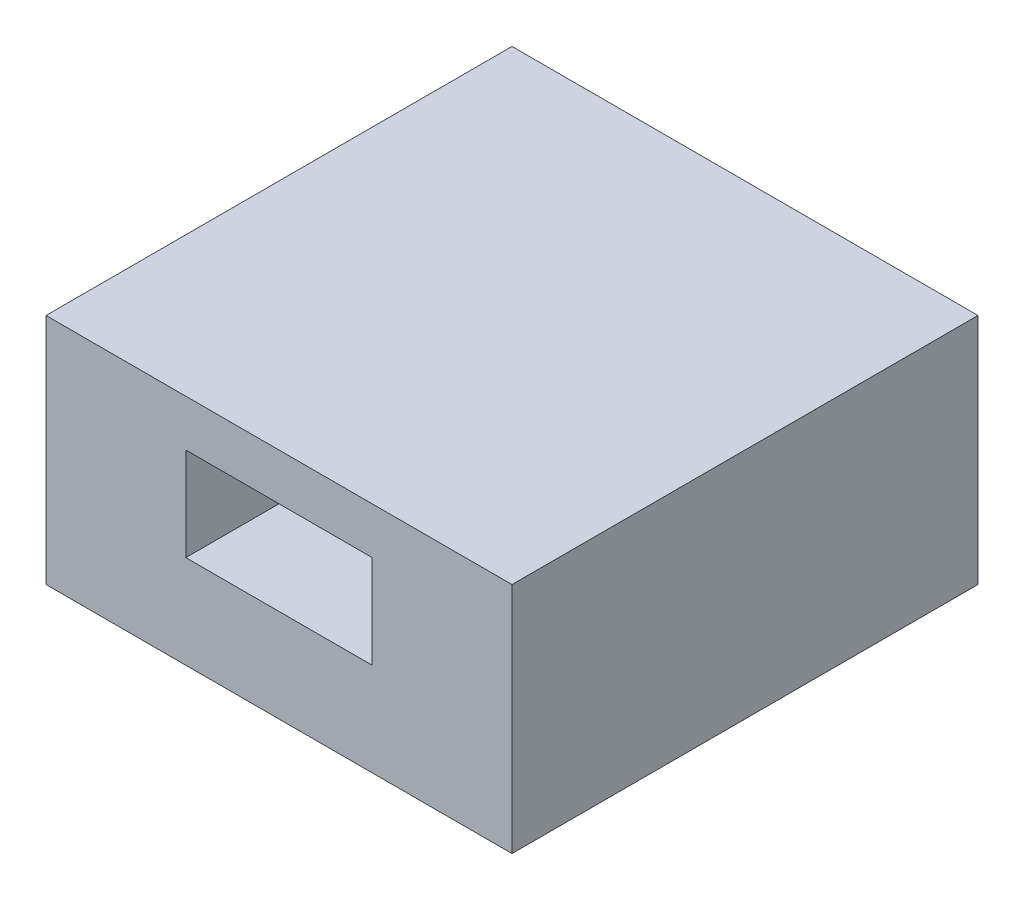
ISO-10303-21;
HEADER;
FILE_DESCRIPTION(('STEP AP214'),'2;1');
FILE_NAME('part.step','',(''),(''),'','','');
FILE_SCHEMA(('AUTOMOTIVE_DESIGN { 1 0 10303 214 1 1 1 1 }'));
ENDSEC;
DATA;
#1=APPLICATION_CONTEXT('core data for automotive mechanical design processes');
#2=APPLICATION_PROTOCOL_DEFINITION('international standard','automotive_design',2000,#1);
#3=PRODUCT_CONTEXT('',#1,'mechanical');
#4=PRODUCT('Part','Part','',(#3));
#5=PRODUCT_RELATED_PRODUCT_CATEGORY('part','',(#4));
#6=PRODUCT_DEFINITION_FORMATION('','',#4);
#7=PRODUCT_DEFINITION_CONTEXT('part definition',#1,'design');
#8=PRODUCT_DEFINITION('design','',#6,#7);
#9=PRODUCT_DEFINITION_SHAPE('','',#8);
#10=(LENGTH_UNIT() NAMED_UNIT(*) SI_UNIT(.MILLI.,.METRE.));
#11=(NAMED_UNIT(*) PLANE_ANGLE_UNIT() SI_UNIT($,.RADIAN.));
#12=(NAMED_UNIT(*) SI_UNIT($,.STERADIAN.) SOLID_ANGLE_UNIT());
#13=UNCERTAINTY_MEASURE_WITH_UNIT(LENGTH_MEASURE(1.E-05),#10,'distance_accuracy_value','');
#14=(GEOMETRIC_REPRESENTATION_CONTEXT(3) GLOBAL_UNCERTAINTY_ASSIGNED_CONTEXT((#13)) GLOBAL_UNIT_ASSIGNED_CONTEXT((#10,
#11,#12)) REPRESENTATION_CONTEXT('',''));
#15=CARTESIAN_POINT('',(0.,0.,0.));
#16=DIRECTION('',(0.,0.,1.));
#17=DIRECTION('',(1.,0.,0.));
#18=AXIS2_PLACEMENT_3D('',#15,#16,#17);
#19=CARTESIAN_POINT('',(0.,0.,8.));
#20=DIRECTION('',(0.,1.,0.));
#21=DIRECTION('',(0.,0.,1.));
#22=AXIS2_PLACEMENT_3D('',#19,#20,#21);
#23=CYLINDRICAL_SURFACE('',#22,3.);
#24=CARTESIAN_POINT('',(0.,0.,8.));
#25=DIRECTION('',(0.,1.,0.));
#26=DIRECTION('',(0.,0.,1.));
#27=AXIS2_PLACEMENT_3D('',#24,#25,#26);
#28=CIRCLE('',#27,3.);
#29=CARTESIAN_POINT('',(0.,0.,11.));
#30=VERTEX_POINT('',#29);
#31=EDGE_CURVE('E194',#30,#30,#28,.T.);
#32=ORIENTED_EDGE('',*,*,#31,.F.);
#33=EDGE_LOOP('',(#32));
#34=FACE_BOUND('',#33,.T.);
#35=CARTESIAN_POINT('',(0.,5.,8.));
#36=DIRECTION('',(0.,1.,0.));
#37=DIRECTION('',(0.,0.,1.));
#38=AXIS2_PLACEMENT_3D('',#35,#36,#37);
#39=CIRCLE('',#38,3.);
#40=CARTESIAN_POINT('',(0.,5.,11.));
#41=VERTEX_POINT('',#40);
#42=EDGE_CURVE('E41',#41,#41,#39,.F.);
#43=ORIENTED_EDGE('',*,*,#42,.F.);
#44=EDGE_LOOP('',(#43));
#45=FACE_BOUND('',#44,.T.);
#46=ADVANCED_FACE('F37',(#34,#45),#23,.F.);
#47=CARTESIAN_POINT('',(-25.,25.,0.));
#48=DIRECTION('',(1.,0.,0.));
#49=DIRECTION('',(0.,0.,-1.));
#50=AXIS2_PLACEMENT_3D('',#47,#48,#49);
#51=PLANE('',#50);
#52=DIRECTION('',(0.,0.,1.));
#53=VECTOR('',#52,1.);
#54=CARTESIAN_POINT('',(-25.,0.,0.));
#55=LINE('',#54,#53);
#56=CARTESIAN_POINT('',(-25.,0.,0.));
#57=VERTEX_POINT('',#56);
#58=CARTESIAN_POINT('',(-25.,0.,50.));
#59=VERTEX_POINT('',#58);
#60=EDGE_CURVE('E222',#57,#59,#55,.T.);
#61=ORIENTED_EDGE('',*,*,#60,.T.);
#62=DIRECTION('',(0.,-1.,0.));
#63=VECTOR('',#62,1.);
#64=CARTESIAN_POINT('',(-25.,25.,50.));
#65=LINE('',#64,#63);
#66=CARTESIAN_POINT('',(-25.,25.,50.));
#67=VERTEX_POINT('',#66);
#68=EDGE_CURVE('E11',#67,#59,#65,.T.);
#69=ORIENTED_EDGE('',*,*,#68,.F.);
#70=DIRECTION('',(0.,0.,1.));
#71=VECTOR('',#70,1.);
#72=CARTESIAN_POINT('',(-25.,25.,0.));
#73=LINE('',#72,#71);
#74=CARTESIAN_POINT('',(-25.,25.,0.));
#75=VERTEX_POINT('',#74);
#76=EDGE_CURVE('E228',#75,#67,#73,.T.);
#77=ORIENTED_EDGE('',*,*,#76,.F.);
#78=DIRECTION('',(0.,-1.,0.));
#79=VECTOR('',#78,1.);
#80=CARTESIAN_POINT('',(-25.,25.,0.));
#81=LINE('',#80,#79);
#82=EDGE_CURVE('E238',#75,#57,#81,.T.);
#83=ORIENTED_EDGE('',*,*,#82,.T.);
#84=EDGE_LOOP('',(#61,#69,#77,#83));
#85=FACE_BOUND('',#84,.T.);
#86=ADVANCED_FACE('F39',(#85),#51,.F.);
#87=CARTESIAN_POINT('',(-25.,25.,50.));
#88=DIRECTION('',(0.,0.,-1.));
#89=DIRECTION('',(-1.,0.,0.));
#90=AXIS2_PLACEMENT_3D('',#87,#88,#89);
#91=PLANE('',#90);
#92=DIRECTION('',(1.,0.,0.));
#93=VECTOR('',#92,1.);
#94=CARTESIAN_POINT('',(-10.,10.,50.));
#95=LINE('',#94,#93);
#96=CARTESIAN_POINT('',(-10.,10.,50.));
#97=VERTEX_POINT('',#96);
#98=CARTESIAN_POINT('',(10.,10.,50.));
#99=VERTEX_POINT('',#98);
#100=EDGE_CURVE('E212',#97,#99,#95,.T.);
#101=ORIENTED_EDGE('',*,*,#100,.F.);
#102=DIRECTION('',(0.,-1.,0.));
#103=VECTOR('',#102,1.);
#104=CARTESIAN_POINT('',(-10.,20.,50.));
#105=LINE('',#104,#103);
#106=CARTESIAN_POINT('',(-10.,20.,50.));
#107=VERTEX_POINT('',#106);
#108=EDGE_CURVE('E61',#107,#97,#105,.T.);
#109=ORIENTED_EDGE('',*,*,#108,.F.);
#110=DIRECTION('',(-1.,0.,0.));
#111=VECTOR('',#110,1.);
#112=CARTESIAN_POINT('',(10.,20.,50.));
#113=LINE('',#112,#111);
#114=CARTESIAN_POINT('',(10.,20.,50.));
#115=VERTEX_POINT('',#114);
#116=EDGE_CURVE('E201',#115,#107,#113,.T.);
#117=ORIENTED_EDGE('',*,*,#116,.F.);
#118=DIRECTION('',(0.,1.,0.));
#119=VECTOR('',#118,1.);
#120=CARTESIAN_POINT('',(10.,20.,50.));
#121=LINE('',#120,#119);
#122=EDGE_CURVE('E215',#99,#115,#121,.T.);
#123=ORIENTED_EDGE('',*,*,#122,.F.);
#124=EDGE_LOOP('',(#101,#109,#117,#123));
#125=FACE_BOUND('',#124,.T.);
#126=DIRECTION('',(1.,0.,0.));
#127=VECTOR('',#126,1.);
#128=CARTESIAN_POINT('',(-25.,0.,50.));
#129=LINE('',#128,#127);
#130=CARTESIAN_POINT('',(25.,0.,50.));
#131=VERTEX_POINT('',#130);
#132=EDGE_CURVE('E241',#59,#131,#129,.T.);
#133=ORIENTED_EDGE('',*,*,#132,.T.);
#134=DIRECTION('',(0.,-1.,0.));
#135=VECTOR('',#134,1.);
#136=CARTESIAN_POINT('',(25.,25.,50.));
#137=LINE('',#136,#135);
#138=CARTESIAN_POINT('',(25.,25.,50.));
#139=VERTEX_POINT('',#138);
#140=EDGE_CURVE('E46',#139,#131,#137,.T.);
#141=ORIENTED_EDGE('',*,*,#140,.F.);
#142=DIRECTION('',(1.,0.,0.));
#143=VECTOR('',#142,1.);
#144=CARTESIAN_POINT('',(-25.,25.,50.));
#145=LINE('',#144,#143);
#146=EDGE_CURVE('E231',#67,#139,#145,.T.);
#147=ORIENTED_EDGE('',*,*,#146,.F.);
#148=ORIENTED_EDGE('',*,*,#68,.T.);
#149=EDGE_LOOP('',(#133,#141,#147,#148));
#150=FACE_BOUND('',#149,.T.);
#151=ADVANCED_FACE('F272',(#125,#150),#91,.F.);
#152=CARTESIAN_POINT('',(25.,25.,0.));
#153=DIRECTION('',(-1.,0.,0.));
#154=DIRECTION('',(0.,0.,1.));
#155=AXIS2_PLACEMENT_3D('',#152,#153,#154);
#156=PLANE('',#155);
#157=DIRECTION('',(0.,0.,-1.));
#158=VECTOR('',#157,1.);
#159=CARTESIAN_POINT('',(25.,0.,0.));
#160=LINE('',#159,#158);
#161=CARTESIAN_POINT('',(25.,0.,0.));
#162=VERTEX_POINT('',#161);
#163=EDGE_CURVE('E243',#131,#162,#160,.T.);
#164=ORIENTED_EDGE('',*,*,#163,.T.);
#165=DIRECTION('',(0.,-1.,0.));
#166=VECTOR('',#165,1.);
#167=CARTESIAN_POINT('',(25.,25.,0.));
#168=LINE('',#167,#166);
#169=CARTESIAN_POINT('',(25.,25.,0.));
#170=VERTEX_POINT('',#169);
#171=EDGE_CURVE('E248',#170,#162,#168,.T.);
#172=ORIENTED_EDGE('',*,*,#171,.F.);
#173=DIRECTION('',(0.,0.,-1.));
#174=VECTOR('',#173,1.);
#175=CARTESIAN_POINT('',(25.,25.,0.));
#176=LINE('',#175,#174);
#177=EDGE_CURVE('E234',#139,#170,#176,.T.);
#178=ORIENTED_EDGE('',*,*,#177,.F.);
#179=ORIENTED_EDGE('',*,*,#140,.T.);
#180=EDGE_LOOP('',(#164,#172,#178,#179));
#181=FACE_BOUND('',#180,.T.);
#182=ADVANCED_FACE('F256',(#181),#156,.F.);
#183=CARTESIAN_POINT('',(25.,25.,0.));
#184=DIRECTION('',(0.,0.,1.));
#185=DIRECTION('',(1.,0.,0.));
#186=AXIS2_PLACEMENT_3D('',#183,#184,#185);
#187=PLANE('',#186);
#188=DIRECTION('',(-1.,0.,0.));
#189=VECTOR('',#188,1.);
#190=CARTESIAN_POINT('',(10.,20.,0.));
#191=LINE('',#190,#189);
#192=CARTESIAN_POINT('',(10.,20.,0.));
#193=VERTEX_POINT('',#192);
#194=CARTESIAN_POINT('',(-10.,20.,0.));
#195=VERTEX_POINT('',#194);
#196=EDGE_CURVE('E207',#193,#195,#191,.T.);
#197=ORIENTED_EDGE('',*,*,#196,.T.);
#198=DIRECTION('',(0.,-1.,0.));
#199=VECTOR('',#198,1.);
#200=CARTESIAN_POINT('',(-10.,20.,0.));
#201=LINE('',#200,#199);
#202=CARTESIAN_POINT('',(-10.,10.,0.));
#203=VERTEX_POINT('',#202);
#204=EDGE_CURVE('E197',#195,#203,#201,.T.);
#205=ORIENTED_EDGE('',*,*,#204,.T.);
#206=DIRECTION('',(1.,0.,0.));
#207=VECTOR('',#206,1.);
#208=CARTESIAN_POINT('',(-10.,10.,0.));
#209=LINE('',#208,#207);
#210=CARTESIAN_POINT('',(10.,10.,0.));
#211=VERTEX_POINT('',#210);
#212=EDGE_CURVE('E200',#203,#211,#209,.T.);
#213=ORIENTED_EDGE('',*,*,#212,.T.);
#214=DIRECTION('',(0.,1.,0.));
#215=VECTOR('',#214,1.);
#216=CARTESIAN_POINT('',(10.,20.,0.));
#217=LINE('',#216,#215);
#218=EDGE_CURVE('E204',#211,#193,#217,.T.);
#219=ORIENTED_EDGE('',*,*,#218,.T.);
#220=EDGE_LOOP('',(#197,#205,#213,#219));
#221=FACE_BOUND('',#220,.T.);
#222=DIRECTION('',(-1.,0.,0.));
#223=VECTOR('',#222,1.);
#224=CARTESIAN_POINT('',(25.,0.,0.));
#225=LINE('',#224,#223);
#226=EDGE_CURVE('E232',#162,#57,#225,.T.);
#227=ORIENTED_EDGE('',*,*,#226,.T.);
#228=ORIENTED_EDGE('',*,*,#82,.F.);
#229=DIRECTION('',(-1.,0.,0.));
#230=VECTOR('',#229,1.);
#231=CARTESIAN_POINT('',(25.,25.,0.));
#232=LINE('',#231,#230);
#233=EDGE_CURVE('E236',#170,#75,#232,.T.);
#234=ORIENTED_EDGE('',*,*,#233,.F.);
#235=ORIENTED_EDGE('',*,*,#171,.T.);
#236=EDGE_LOOP('',(#227,#228,#234,#235));
#237=FACE_BOUND('',#236,.T.);
#238=ADVANCED_FACE('F265',(#221,#237),#187,.F.);
#239=CARTESIAN_POINT('',(0.,25.,0.));
#240=DIRECTION('',(0.,1.,0.));
#241=DIRECTION('',(0.,0.,1.));
#242=AXIS2_PLACEMENT_3D('',#239,#240,#241);
#243=PLANE('',#242);
#244=ORIENTED_EDGE('',*,*,#76,.T.);
#245=ORIENTED_EDGE('',*,*,#146,.T.);
#246=ORIENTED_EDGE('',*,*,#177,.T.);
#247=ORIENTED_EDGE('',*,*,#233,.T.);
#248=EDGE_LOOP('',(#244,#245,#246,#247));
#249=FACE_BOUND('',#248,.T.);
#250=ADVANCED_FACE('F271',(#249),#243,.T.);
#251=CARTESIAN_POINT('',(0.,0.,0.));
#252=DIRECTION('',(0.,1.,0.));
#253=DIRECTION('',(0.,0.,1.));
#254=AXIS2_PLACEMENT_3D('',#251,#252,#253);
#255=PLANE('',#254);
#256=ORIENTED_EDGE('',*,*,#31,.T.);
#257=EDGE_LOOP('',(#256));
#258=FACE_BOUND('',#257,.T.);
#259=ORIENTED_EDGE('',*,*,#60,.F.);
#260=ORIENTED_EDGE('',*,*,#226,.F.);
#261=ORIENTED_EDGE('',*,*,#163,.F.);
#262=ORIENTED_EDGE('',*,*,#132,.F.);
#263=EDGE_LOOP('',(#259,#260,#261,#262));
#264=FACE_BOUND('',#263,.T.);
#265=ADVANCED_FACE('F262',(#258,#264),#255,.F.);
#266=CARTESIAN_POINT('',(-10.,20.,0.));
#267=DIRECTION('',(-1.,0.,0.));
#268=DIRECTION('',(0.,0.,1.));
#269=AXIS2_PLACEMENT_3D('',#266,#267,#268);
#270=PLANE('',#269);
#271=ORIENTED_EDGE('',*,*,#108,.T.);
#272=DIRECTION('',(0.,0.,1.));
#273=VECTOR('',#272,1.);
#274=CARTESIAN_POINT('',(-10.,10.,0.));
#275=LINE('',#274,#273);
#276=EDGE_CURVE('E210',#203,#97,#275,.T.);
#277=ORIENTED_EDGE('',*,*,#276,.F.);
#278=ORIENTED_EDGE('',*,*,#204,.F.);
#279=DIRECTION('',(0.,0.,1.));
#280=VECTOR('',#279,1.);
#281=CARTESIAN_POINT('',(-10.,20.,0.));
#282=LINE('',#281,#280);
#283=EDGE_CURVE('E220',#195,#107,#282,.T.);
#284=ORIENTED_EDGE('',*,*,#283,.T.);
#285=EDGE_LOOP('',(#271,#277,#278,#284));
#286=FACE_BOUND('',#285,.T.);
#287=ADVANCED_FACE('F295',(#286),#270,.F.);
#288=CARTESIAN_POINT('',(10.,20.,0.));
#289=DIRECTION('',(0.,1.,0.));
#290=DIRECTION('',(0.,0.,1.));
#291=AXIS2_PLACEMENT_3D('',#288,#289,#290);
#292=PLANE('',#291);
#293=ORIENTED_EDGE('',*,*,#116,.T.);
#294=ORIENTED_EDGE('',*,*,#283,.F.);
#295=ORIENTED_EDGE('',*,*,#196,.F.);
#296=DIRECTION('',(0.,0.,1.));
#297=VECTOR('',#296,1.);
#298=CARTESIAN_POINT('',(10.,20.,0.));
#299=LINE('',#298,#297);
#300=EDGE_CURVE('E223',#193,#115,#299,.T.);
#301=ORIENTED_EDGE('',*,*,#300,.T.);
#302=EDGE_LOOP('',(#293,#294,#295,#301));
#303=FACE_BOUND('',#302,.T.);
#304=ADVANCED_FACE('F291',(#303),#292,.F.);
#305=CARTESIAN_POINT('',(10.,20.,0.));
#306=DIRECTION('',(1.,0.,0.));
#307=DIRECTION('',(0.,0.,-1.));
#308=AXIS2_PLACEMENT_3D('',#305,#306,#307);
#309=PLANE('',#308);
#310=ORIENTED_EDGE('',*,*,#122,.T.);
#311=ORIENTED_EDGE('',*,*,#300,.F.);
#312=ORIENTED_EDGE('',*,*,#218,.F.);
#313=DIRECTION('',(0.,0.,1.));
#314=VECTOR('',#313,1.);
#315=CARTESIAN_POINT('',(10.,10.,0.));
#316=LINE('',#315,#314);
#317=EDGE_CURVE('E225',#211,#99,#316,.T.);
#318=ORIENTED_EDGE('',*,*,#317,.T.);
#319=EDGE_LOOP('',(#310,#311,#312,#318));
#320=FACE_BOUND('',#319,.T.);
#321=ADVANCED_FACE('F294',(#320),#309,.F.);
#322=CARTESIAN_POINT('',(-10.,10.,0.));
#323=DIRECTION('',(0.,-1.,0.));
#324=DIRECTION('',(0.,0.,-1.));
#325=AXIS2_PLACEMENT_3D('',#322,#323,#324);
#326=PLANE('',#325);
#327=DIRECTION('',(-1.,0.,0.));
#328=VECTOR('',#327,1.);
#329=CARTESIAN_POINT('',(2.88675134594813,10.,3.));
#330=LINE('',#329,#328);
#331=CARTESIAN_POINT('',(2.88675134594813,10.,3.));
#332=VERTEX_POINT('',#331);
#333=CARTESIAN_POINT('',(-2.88675134594812,10.,3.));
#334=VERTEX_POINT('',#333);
#335=EDGE_CURVE('E175',#332,#334,#330,.T.);
#336=ORIENTED_EDGE('',*,*,#335,.F.);
#337=DIRECTION('',(-0.5,0.,-0.866025403784438));
#338=VECTOR('',#337,1.);
#339=CARTESIAN_POINT('',(5.77350269189626,10.,8.));
#340=LINE('',#339,#338);
#341=CARTESIAN_POINT('',(5.77350269189626,10.,8.));
#342=VERTEX_POINT('',#341);
#343=EDGE_CURVE('E53',#342,#332,#340,.T.);
#344=ORIENTED_EDGE('',*,*,#343,.F.);
#345=DIRECTION('',(0.5,0.,-0.866025403784439));
#346=VECTOR('',#345,1.);
#347=CARTESIAN_POINT('',(2.88675134594813,10.,13.));
#348=LINE('',#347,#346);
#349=CARTESIAN_POINT('',(2.88675134594813,10.,13.));
#350=VERTEX_POINT('',#349);
#351=EDGE_CURVE('E161',#350,#342,#348,.T.);
#352=ORIENTED_EDGE('',*,*,#351,.F.);
#353=DIRECTION('',(1.,0.,0.));
#354=VECTOR('',#353,1.);
#355=CARTESIAN_POINT('',(-2.88675134594812,10.,13.));
#356=LINE('',#355,#354);
#357=CARTESIAN_POINT('',(-2.88675134594812,10.,13.));
#358=VERTEX_POINT('',#357);
#359=EDGE_CURVE('E164',#358,#350,#356,.T.);
#360=ORIENTED_EDGE('',*,*,#359,.F.);
#361=DIRECTION('',(0.5,0.,0.866025403784438));
#362=VECTOR('',#361,1.);
#363=CARTESIAN_POINT('',(-5.77350269189625,10.,8.));
#364=LINE('',#363,#362);
#365=CARTESIAN_POINT('',(-5.77350269189625,10.,8.));
#366=VERTEX_POINT('',#365);
#367=EDGE_CURVE('E180',#366,#358,#364,.T.);
#368=ORIENTED_EDGE('',*,*,#367,.F.);
#369=DIRECTION('',(-0.5,0.,0.866025403784439));
#370=VECTOR('',#369,1.);
#371=CARTESIAN_POINT('',(-2.88675134594812,10.,3.));
#372=LINE('',#371,#370);
#373=EDGE_CURVE('E177',#334,#366,#372,.T.);
#374=ORIENTED_EDGE('',*,*,#373,.F.);
#375=EDGE_LOOP('',(#336,#344,#352,#360,#368,#374));
#376=FACE_BOUND('',#375,.T.);
#377=ORIENTED_EDGE('',*,*,#100,.T.);
#378=ORIENTED_EDGE('',*,*,#317,.F.);
#379=ORIENTED_EDGE('',*,*,#212,.F.);
#380=ORIENTED_EDGE('',*,*,#276,.T.);
#381=EDGE_LOOP('',(#377,#378,#379,#380));
#382=FACE_BOUND('',#381,.T.);
#383=ADVANCED_FACE('F299',(#376,#382),#326,.F.);
#384=CARTESIAN_POINT('',(0.,5.,0.));
#385=DIRECTION('',(0.,1.,0.));
#386=DIRECTION('',(0.,0.,1.));
#387=AXIS2_PLACEMENT_3D('',#384,#385,#386);
#388=PLANE('',#387);
#389=DIRECTION('',(-0.5,0.,-0.866025403784438));
#390=VECTOR('',#389,1.);
#391=CARTESIAN_POINT('',(5.77350269189626,5.,8.));
#392=LINE('',#391,#390);
#393=CARTESIAN_POINT('',(5.77350269189626,5.,8.));
#394=VERTEX_POINT('',#393);
#395=CARTESIAN_POINT('',(2.88675134594813,5.,3.));
#396=VERTEX_POINT('',#395);
#397=EDGE_CURVE('E141',#394,#396,#392,.T.);
#398=ORIENTED_EDGE('',*,*,#397,.T.);
#399=DIRECTION('',(-1.,0.,0.));
#400=VECTOR('',#399,1.);
#401=CARTESIAN_POINT('',(2.88675134594813,5.,3.));
#402=LINE('',#401,#400);
#403=CARTESIAN_POINT('',(-2.88675134594812,5.,3.));
#404=VERTEX_POINT('',#403);
#405=EDGE_CURVE('E150',#396,#404,#402,.T.);
#406=ORIENTED_EDGE('',*,*,#405,.T.);
#407=DIRECTION('',(-0.5,0.,0.866025403784439));
#408=VECTOR('',#407,1.);
#409=CARTESIAN_POINT('',(-2.88675134594812,5.,3.));
#410=LINE('',#409,#408);
#411=CARTESIAN_POINT('',(-5.77350269189625,5.,8.));
#412=VERTEX_POINT('',#411);
#413=EDGE_CURVE('E155',#404,#412,#410,.T.);
#414=ORIENTED_EDGE('',*,*,#413,.T.);
#415=DIRECTION('',(0.5,0.,0.866025403784438));
#416=VECTOR('',#415,1.);
#417=CARTESIAN_POINT('',(-5.77350269189625,5.,8.));
#418=LINE('',#417,#416);
#419=CARTESIAN_POINT('',(-2.88675134594812,5.,13.));
#420=VERTEX_POINT('',#419);
#421=EDGE_CURVE('E168',#412,#420,#418,.T.);
#422=ORIENTED_EDGE('',*,*,#421,.T.);
#423=DIRECTION('',(1.,0.,0.));
#424=VECTOR('',#423,1.);
#425=CARTESIAN_POINT('',(-2.88675134594812,5.,13.));
#426=LINE('',#425,#424);
#427=CARTESIAN_POINT('',(2.88675134594813,5.,13.));
#428=VERTEX_POINT('',#427);
#429=EDGE_CURVE('E171',#420,#428,#426,.T.);
#430=ORIENTED_EDGE('',*,*,#429,.T.);
#431=DIRECTION('',(0.5,0.,-0.866025403784439));
#432=VECTOR('',#431,1.);
#433=CARTESIAN_POINT('',(2.88675134594813,5.,13.));
#434=LINE('',#433,#432);
#435=EDGE_CURVE('E147',#428,#394,#434,.T.);
#436=ORIENTED_EDGE('',*,*,#435,.T.);
#437=EDGE_LOOP('',(#398,#406,#414,#422,#430,#436));
#438=FACE_BOUND('',#437,.T.);
#439=ORIENTED_EDGE('',*,*,#42,.T.);
#440=EDGE_LOOP('',(#439));
#441=FACE_BOUND('',#440,.T.);
#442=ADVANCED_FACE('F157',(#438,#441),#388,.T.);
#443=CARTESIAN_POINT('',(5.77350269189626,5.,8.));
#444=DIRECTION('',(0.866025403784438,0.,-0.5));
#445=DIRECTION('',(-0.5,0.,-0.866025403784438));
#446=AXIS2_PLACEMENT_3D('',#443,#444,#445);
#447=PLANE('',#446);
#448=ORIENTED_EDGE('',*,*,#343,.T.);
#449=DIRECTION('',(0.,1.,0.));
#450=VECTOR('',#449,1.);
#451=CARTESIAN_POINT('',(2.88675134594813,5.,3.));
#452=LINE('',#451,#450);
#453=EDGE_CURVE('E137',#396,#332,#452,.T.);
#454=ORIENTED_EDGE('',*,*,#453,.F.);
#455=ORIENTED_EDGE('',*,*,#397,.F.);
#456=DIRECTION('',(0.,1.,0.));
#457=VECTOR('',#456,1.);
#458=CARTESIAN_POINT('',(5.77350269189626,5.,8.));
#459=LINE('',#458,#457);
#460=EDGE_CURVE('E185',#394,#342,#459,.T.);
#461=ORIENTED_EDGE('',*,*,#460,.T.);
#462=EDGE_LOOP('',(#448,#454,#455,#461));
#463=FACE_BOUND('',#462,.T.);
#464=ADVANCED_FACE('F139',(#463),#447,.F.);
#465=CARTESIAN_POINT('',(2.88675134594813,5.,13.));
#466=DIRECTION('',(0.866025403784439,0.,0.5));
#467=DIRECTION('',(0.5,0.,-0.866025403784439));
#468=AXIS2_PLACEMENT_3D('',#465,#466,#467);
#469=PLANE('',#468);
#470=ORIENTED_EDGE('',*,*,#351,.T.);
#471=ORIENTED_EDGE('',*,*,#460,.F.);
#472=ORIENTED_EDGE('',*,*,#435,.F.);
#473=DIRECTION('',(0.,1.,0.));
#474=VECTOR('',#473,1.);
#475=CARTESIAN_POINT('',(2.88675134594813,5.,13.));
#476=LINE('',#475,#474);
#477=EDGE_CURVE('E187',#428,#350,#476,.T.);
#478=ORIENTED_EDGE('',*,*,#477,.T.);
#479=EDGE_LOOP('',(#470,#471,#472,#478));
#480=FACE_BOUND('',#479,.T.);
#481=ADVANCED_FACE('F360',(#480),#469,.F.);
#482=CARTESIAN_POINT('',(-2.88675134594812,5.,13.));
#483=DIRECTION('',(0.,0.,1.));
#484=DIRECTION('',(1.,0.,0.));
#485=AXIS2_PLACEMENT_3D('',#482,#483,#484);
#486=PLANE('',#485);
#487=ORIENTED_EDGE('',*,*,#359,.T.);
#488=ORIENTED_EDGE('',*,*,#477,.F.);
#489=ORIENTED_EDGE('',*,*,#429,.F.);
#490=DIRECTION('',(0.,1.,0.));
#491=VECTOR('',#490,1.);
#492=CARTESIAN_POINT('',(-2.88675134594812,5.,13.));
#493=LINE('',#492,#491);
#494=EDGE_CURVE('E189',#420,#358,#493,.T.);
#495=ORIENTED_EDGE('',*,*,#494,.T.);
#496=EDGE_LOOP('',(#487,#488,#489,#495));
#497=FACE_BOUND('',#496,.T.);
#498=ADVANCED_FACE('F366',(#497),#486,.F.);
#499=CARTESIAN_POINT('',(-5.77350269189625,5.,8.));
#500=DIRECTION('',(-0.866025403784438,0.,0.5));
#501=DIRECTION('',(0.5,0.,0.866025403784438));
#502=AXIS2_PLACEMENT_3D('',#499,#500,#501);
#503=PLANE('',#502);
#504=ORIENTED_EDGE('',*,*,#367,.T.);
#505=ORIENTED_EDGE('',*,*,#494,.F.);
#506=ORIENTED_EDGE('',*,*,#421,.F.);
#507=DIRECTION('',(0.,1.,0.));
#508=VECTOR('',#507,1.);
#509=CARTESIAN_POINT('',(-5.77350269189625,5.,8.));
#510=LINE('',#509,#508);
#511=EDGE_CURVE('E191',#412,#366,#510,.T.);
#512=ORIENTED_EDGE('',*,*,#511,.T.);
#513=EDGE_LOOP('',(#504,#505,#506,#512));
#514=FACE_BOUND('',#513,.T.);
#515=ADVANCED_FACE('F374',(#514),#503,.F.);
#516=CARTESIAN_POINT('',(-2.88675134594812,5.,3.));
#517=DIRECTION('',(-0.866025403784439,0.,-0.5));
#518=DIRECTION('',(-0.5,0.,0.866025403784439));
#519=AXIS2_PLACEMENT_3D('',#516,#517,#518);
#520=PLANE('',#519);
#521=ORIENTED_EDGE('',*,*,#373,.T.);
#522=ORIENTED_EDGE('',*,*,#511,.F.);
#523=ORIENTED_EDGE('',*,*,#413,.F.);
#524=DIRECTION('',(0.,1.,0.));
#525=VECTOR('',#524,1.);
#526=CARTESIAN_POINT('',(-2.88675134594812,5.,3.));
#527=LINE('',#526,#525);
#528=EDGE_CURVE('E146',#404,#334,#527,.T.);
#529=ORIENTED_EDGE('',*,*,#528,.T.);
#530=EDGE_LOOP('',(#521,#522,#523,#529));
#531=FACE_BOUND('',#530,.T.);
#532=ADVANCED_FACE('F382',(#531),#520,.F.);
#533=CARTESIAN_POINT('',(2.88675134594813,5.,3.));
#534=DIRECTION('',(0.,0.,-1.));
#535=DIRECTION('',(-1.,0.,0.));
#536=AXIS2_PLACEMENT_3D('',#533,#534,#535);
#537=PLANE('',#536);
#538=ORIENTED_EDGE('',*,*,#335,.T.);
#539=ORIENTED_EDGE('',*,*,#528,.F.);
#540=ORIENTED_EDGE('',*,*,#405,.F.);
#541=ORIENTED_EDGE('',*,*,#453,.T.);
#542=EDGE_LOOP('',(#538,#539,#540,#541));
#543=FACE_BOUND('',#542,.T.);
#544=ADVANCED_FACE('F151',(#543),#537,.F.);
#545=CLOSED_SHELL('',(#46,#86,#151,#182,#238,#250,#265,#287,#304,#321,#383,#442,#464,#481,#498,
#515,#532,#544));
#546=MANIFOLD_SOLID_BREP('B2',#545);
#547=ADVANCED_BREP_SHAPE_REPRESENTATION('',(#18,#546),#14);
#548=SHAPE_DEFINITION_REPRESENTATION(#9,#547);
ENDSEC;
END-ISO-10303-21;
